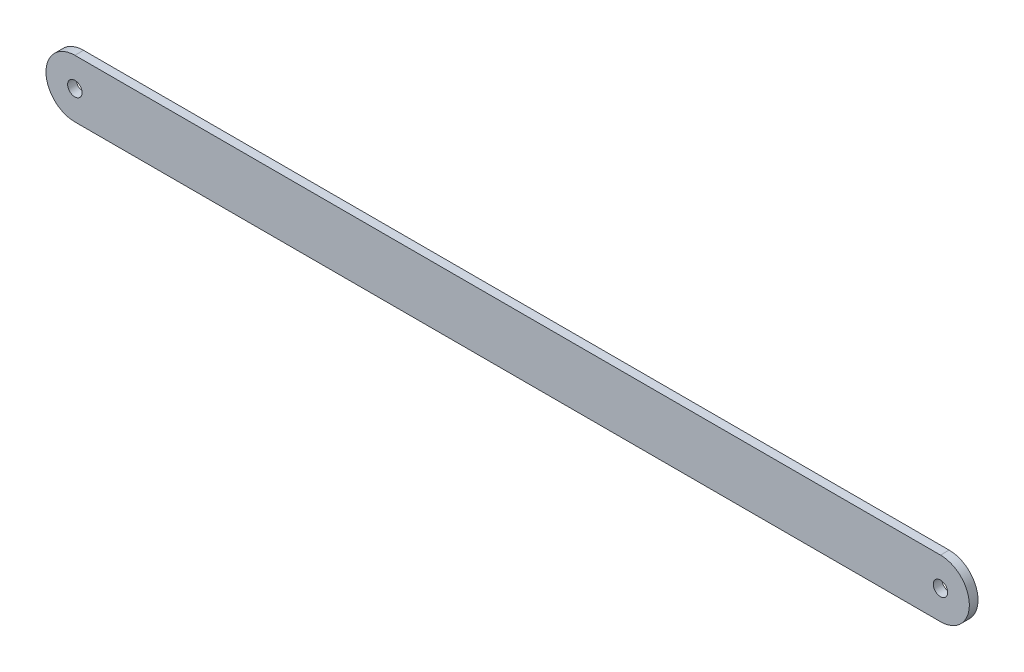
ISO-10303-21;
HEADER;
FILE_DESCRIPTION(('STEP AP214'),'2;1');
FILE_NAME('part.step','',(''),(''),'','','');
FILE_SCHEMA(('AUTOMOTIVE_DESIGN { 1 0 10303 214 1 1 1 1 }'));
ENDSEC;
DATA;
#1=APPLICATION_CONTEXT('core data for automotive mechanical design processes');
#2=APPLICATION_PROTOCOL_DEFINITION('international standard','automotive_design',2000,#1);
#3=PRODUCT_CONTEXT('',#1,'mechanical');
#4=PRODUCT('Part','Part','',(#3));
#5=PRODUCT_RELATED_PRODUCT_CATEGORY('part','',(#4));
#6=PRODUCT_DEFINITION_FORMATION('','',#4);
#7=PRODUCT_DEFINITION_CONTEXT('part definition',#1,'design');
#8=PRODUCT_DEFINITION('design','',#6,#7);
#9=PRODUCT_DEFINITION_SHAPE('','',#8);
#10=(LENGTH_UNIT() NAMED_UNIT(*) SI_UNIT(.MILLI.,.METRE.));
#11=(NAMED_UNIT(*) PLANE_ANGLE_UNIT() SI_UNIT($,.RADIAN.));
#12=(NAMED_UNIT(*) SI_UNIT($,.STERADIAN.) SOLID_ANGLE_UNIT());
#13=UNCERTAINTY_MEASURE_WITH_UNIT(LENGTH_MEASURE(1.E-05),#10,'distance_accuracy_value','');
#14=(GEOMETRIC_REPRESENTATION_CONTEXT(3) GLOBAL_UNCERTAINTY_ASSIGNED_CONTEXT((#13)) GLOBAL_UNIT_ASSIGNED_CONTEXT((#10,
#11,#12)) REPRESENTATION_CONTEXT('',''));
#15=CARTESIAN_POINT('',(0.,0.,0.));
#16=DIRECTION('',(0.,0.,1.));
#17=DIRECTION('',(1.,0.,0.));
#18=AXIS2_PLACEMENT_3D('',#15,#16,#17);
#19=CARTESIAN_POINT('',(-150.,0.,3.));
#20=DIRECTION('',(0.,0.,-1.));
#21=DIRECTION('',(-1.,0.,0.));
#22=AXIS2_PLACEMENT_3D('',#19,#20,#21);
#23=CYLINDRICAL_SURFACE('',#22,10.0000000000001);
#24=CARTESIAN_POINT('',(-150.,0.,0.));
#25=DIRECTION('',(0.,0.,1.));
#26=DIRECTION('',(1.,0.,0.));
#27=AXIS2_PLACEMENT_3D('',#24,#25,#26);
#28=CIRCLE('',#27,10.0000000000001);
#29=CARTESIAN_POINT('',(-150.,10.0000000000001,0.));
#30=VERTEX_POINT('',#29);
#31=CARTESIAN_POINT('',(-150.,-10.0000000000001,0.));
#32=VERTEX_POINT('',#31);
#33=EDGE_CURVE('E102',#30,#32,#28,.T.);
#34=ORIENTED_EDGE('',*,*,#33,.T.);
#35=DIRECTION('',(0.,0.,-1.));
#36=VECTOR('',#35,1.);
#37=CARTESIAN_POINT('',(-150.,-10.0000000000001,3.));
#38=LINE('',#37,#36);
#39=CARTESIAN_POINT('',(-150.,-10.0000000000001,3.));
#40=VERTEX_POINT('',#39);
#41=EDGE_CURVE('E11',#40,#32,#38,.T.);
#42=ORIENTED_EDGE('',*,*,#41,.F.);
#43=CARTESIAN_POINT('',(-150.,0.,3.));
#44=DIRECTION('',(0.,0.,1.));
#45=DIRECTION('',(1.,0.,0.));
#46=AXIS2_PLACEMENT_3D('',#43,#44,#45);
#47=CIRCLE('',#46,10.0000000000001);
#48=CARTESIAN_POINT('',(-150.,10.0000000000001,3.));
#49=VERTEX_POINT('',#48);
#50=EDGE_CURVE('E90',#49,#40,#47,.T.);
#51=ORIENTED_EDGE('',*,*,#50,.F.);
#52=DIRECTION('',(0.,0.,-1.));
#53=VECTOR('',#52,1.);
#54=CARTESIAN_POINT('',(-150.,10.0000000000001,3.));
#55=LINE('',#54,#53);
#56=EDGE_CURVE('E98',#49,#30,#55,.T.);
#57=ORIENTED_EDGE('',*,*,#56,.T.);
#58=EDGE_LOOP('',(#34,#42,#51,#57));
#59=FACE_BOUND('',#58,.T.);
#60=ADVANCED_FACE('F39',(#59),#23,.T.);
#61=CARTESIAN_POINT('',(-150.,-10.0000000000001,3.));
#62=DIRECTION('',(0.,1.,0.));
#63=DIRECTION('',(-1.,0.,0.));
#64=AXIS2_PLACEMENT_3D('',#61,#62,#63);
#65=PLANE('',#64);
#66=DIRECTION('',(1.,0.,0.));
#67=VECTOR('',#66,1.);
#68=CARTESIAN_POINT('',(-150.,-10.0000000000001,0.));
#69=LINE('',#68,#67);
#70=CARTESIAN_POINT('',(150.,-10.0000000000001,0.));
#71=VERTEX_POINT('',#70);
#72=EDGE_CURVE('E94',#32,#71,#69,.T.);
#73=ORIENTED_EDGE('',*,*,#72,.T.);
#74=DIRECTION('',(0.,0.,-1.));
#75=VECTOR('',#74,1.);
#76=CARTESIAN_POINT('',(150.,-10.0000000000001,3.));
#77=LINE('',#76,#75);
#78=CARTESIAN_POINT('',(150.,-10.0000000000001,3.));
#79=VERTEX_POINT('',#78);
#80=EDGE_CURVE('E47',#79,#71,#77,.T.);
#81=ORIENTED_EDGE('',*,*,#80,.F.);
#82=DIRECTION('',(1.,0.,0.));
#83=VECTOR('',#82,1.);
#84=CARTESIAN_POINT('',(-150.,-10.0000000000001,3.));
#85=LINE('',#84,#83);
#86=EDGE_CURVE('E85',#40,#79,#85,.T.);
#87=ORIENTED_EDGE('',*,*,#86,.F.);
#88=ORIENTED_EDGE('',*,*,#41,.T.);
#89=EDGE_LOOP('',(#73,#81,#87,#88));
#90=FACE_BOUND('',#89,.T.);
#91=ADVANCED_FACE('F93',(#90),#65,.F.);
#92=CARTESIAN_POINT('',(150.,0.,3.));
#93=DIRECTION('',(0.,0.,-1.));
#94=DIRECTION('',(-1.,0.,0.));
#95=AXIS2_PLACEMENT_3D('',#92,#93,#94);
#96=CYLINDRICAL_SURFACE('',#95,10.0000000000001);
#97=CARTESIAN_POINT('',(150.,0.,0.));
#98=DIRECTION('',(0.,0.,1.));
#99=DIRECTION('',(1.,0.,0.));
#100=AXIS2_PLACEMENT_3D('',#97,#98,#99);
#101=CIRCLE('',#100,10.0000000000001);
#102=CARTESIAN_POINT('',(150.,10.0000000000001,0.));
#103=VERTEX_POINT('',#102);
#104=EDGE_CURVE('E72',#71,#103,#101,.T.);
#105=ORIENTED_EDGE('',*,*,#104,.T.);
#106=DIRECTION('',(0.,0.,-1.));
#107=VECTOR('',#106,1.);
#108=CARTESIAN_POINT('',(150.,10.0000000000001,3.));
#109=LINE('',#108,#107);
#110=CARTESIAN_POINT('',(150.,10.0000000000001,3.));
#111=VERTEX_POINT('',#110);
#112=EDGE_CURVE('E95',#111,#103,#109,.T.);
#113=ORIENTED_EDGE('',*,*,#112,.F.);
#114=CARTESIAN_POINT('',(150.,0.,3.));
#115=DIRECTION('',(0.,0.,1.));
#116=DIRECTION('',(1.,0.,0.));
#117=AXIS2_PLACEMENT_3D('',#114,#115,#116);
#118=CIRCLE('',#117,10.0000000000001);
#119=EDGE_CURVE('E88',#79,#111,#118,.T.);
#120=ORIENTED_EDGE('',*,*,#119,.F.);
#121=ORIENTED_EDGE('',*,*,#80,.T.);
#122=EDGE_LOOP('',(#105,#113,#120,#121));
#123=FACE_BOUND('',#122,.T.);
#124=ADVANCED_FACE('F96',(#123),#96,.T.);
#125=CARTESIAN_POINT('',(-150.,10.0000000000001,3.));
#126=DIRECTION('',(0.,-1.,0.));
#127=DIRECTION('',(1.,0.,0.));
#128=AXIS2_PLACEMENT_3D('',#125,#126,#127);
#129=PLANE('',#128);
#130=DIRECTION('',(-1.,0.,0.));
#131=VECTOR('',#130,1.);
#132=CARTESIAN_POINT('',(-150.,10.0000000000001,0.));
#133=LINE('',#132,#131);
#134=EDGE_CURVE('E78',#103,#30,#133,.T.);
#135=ORIENTED_EDGE('',*,*,#134,.T.);
#136=ORIENTED_EDGE('',*,*,#56,.F.);
#137=DIRECTION('',(-1.,0.,0.));
#138=VECTOR('',#137,1.);
#139=CARTESIAN_POINT('',(-150.,10.0000000000001,3.));
#140=LINE('',#139,#138);
#141=EDGE_CURVE('E55',#111,#49,#140,.T.);
#142=ORIENTED_EDGE('',*,*,#141,.F.);
#143=ORIENTED_EDGE('',*,*,#112,.T.);
#144=EDGE_LOOP('',(#135,#136,#142,#143));
#145=FACE_BOUND('',#144,.T.);
#146=ADVANCED_FACE('F110',(#145),#129,.F.);
#147=CARTESIAN_POINT('',(-150.,0.,3.));
#148=DIRECTION('',(0.,0.,1.));
#149=DIRECTION('',(1.,0.,0.));
#150=AXIS2_PLACEMENT_3D('',#147,#148,#149);
#151=PLANE('',#150);
#152=CARTESIAN_POINT('',(150.,0.,3.));
#153=DIRECTION('',(0.,0.,-1.));
#154=DIRECTION('',(-1.,0.,0.));
#155=AXIS2_PLACEMENT_3D('',#152,#153,#154);
#156=CIRCLE('',#155,2.5);
#157=CARTESIAN_POINT('',(147.5,0.,3.));
#158=VERTEX_POINT('',#157);
#159=EDGE_CURVE('E105',#158,#158,#156,.T.);
#160=ORIENTED_EDGE('',*,*,#159,.T.);
#161=EDGE_LOOP('',(#160));
#162=FACE_BOUND('',#161,.T.);
#163=CARTESIAN_POINT('',(-150.,0.,3.));
#164=DIRECTION('',(0.,0.,-1.));
#165=DIRECTION('',(-1.,0.,0.));
#166=AXIS2_PLACEMENT_3D('',#163,#164,#165);
#167=CIRCLE('',#166,2.5);
#168=CARTESIAN_POINT('',(-152.5,0.,3.));
#169=VERTEX_POINT('',#168);
#170=EDGE_CURVE('E116',#169,#169,#167,.T.);
#171=ORIENTED_EDGE('',*,*,#170,.T.);
#172=EDGE_LOOP('',(#171));
#173=FACE_BOUND('',#172,.T.);
#174=ORIENTED_EDGE('',*,*,#50,.T.);
#175=ORIENTED_EDGE('',*,*,#86,.T.);
#176=ORIENTED_EDGE('',*,*,#119,.T.);
#177=ORIENTED_EDGE('',*,*,#141,.T.);
#178=EDGE_LOOP('',(#174,#175,#176,#177));
#179=FACE_BOUND('',#178,.T.);
#180=ADVANCED_FACE('F86',(#162,#173,#179),#151,.T.);
#181=CARTESIAN_POINT('',(-150.,0.,0.));
#182=DIRECTION('',(0.,0.,1.));
#183=DIRECTION('',(1.,0.,0.));
#184=AXIS2_PLACEMENT_3D('',#181,#182,#183);
#185=PLANE('',#184);
#186=CARTESIAN_POINT('',(150.,0.,0.));
#187=DIRECTION('',(0.,0.,-1.));
#188=DIRECTION('',(-1.,0.,0.));
#189=AXIS2_PLACEMENT_3D('',#186,#187,#188);
#190=CIRCLE('',#189,2.5);
#191=CARTESIAN_POINT('',(147.5,0.,0.));
#192=VERTEX_POINT('',#191);
#193=EDGE_CURVE('E122',#192,#192,#190,.T.);
#194=ORIENTED_EDGE('',*,*,#193,.F.);
#195=EDGE_LOOP('',(#194));
#196=FACE_BOUND('',#195,.T.);
#197=CARTESIAN_POINT('',(-150.,0.,0.));
#198=DIRECTION('',(0.,0.,-1.));
#199=DIRECTION('',(-1.,0.,0.));
#200=AXIS2_PLACEMENT_3D('',#197,#198,#199);
#201=CIRCLE('',#200,2.5);
#202=CARTESIAN_POINT('',(-152.5,0.,0.));
#203=VERTEX_POINT('',#202);
#204=EDGE_CURVE('E119',#203,#203,#201,.T.);
#205=ORIENTED_EDGE('',*,*,#204,.F.);
#206=EDGE_LOOP('',(#205));
#207=FACE_BOUND('',#206,.T.);
#208=ORIENTED_EDGE('',*,*,#33,.F.);
#209=ORIENTED_EDGE('',*,*,#134,.F.);
#210=ORIENTED_EDGE('',*,*,#104,.F.);
#211=ORIENTED_EDGE('',*,*,#72,.F.);
#212=EDGE_LOOP('',(#208,#209,#210,#211));
#213=FACE_BOUND('',#212,.T.);
#214=ADVANCED_FACE('F113',(#196,#207,#213),#185,.F.);
#215=CARTESIAN_POINT('',(-150.,0.,3.));
#216=DIRECTION('',(0.,0.,-1.));
#217=DIRECTION('',(-1.,0.,0.));
#218=AXIS2_PLACEMENT_3D('',#215,#216,#217);
#219=CYLINDRICAL_SURFACE('',#218,2.5);
#220=ORIENTED_EDGE('',*,*,#170,.F.);
#221=EDGE_LOOP('',(#220));
#222=FACE_BOUND('',#221,.T.);
#223=ORIENTED_EDGE('',*,*,#204,.T.);
#224=EDGE_LOOP('',(#223));
#225=FACE_BOUND('',#224,.T.);
#226=ADVANCED_FACE('F133',(#222,#225),#219,.F.);
#227=CARTESIAN_POINT('',(150.,0.,3.));
#228=DIRECTION('',(0.,0.,-1.));
#229=DIRECTION('',(-1.,0.,0.));
#230=AXIS2_PLACEMENT_3D('',#227,#228,#229);
#231=CYLINDRICAL_SURFACE('',#230,2.5);
#232=ORIENTED_EDGE('',*,*,#159,.F.);
#233=EDGE_LOOP('',(#232));
#234=FACE_BOUND('',#233,.T.);
#235=ORIENTED_EDGE('',*,*,#193,.T.);
#236=EDGE_LOOP('',(#235));
#237=FACE_BOUND('',#236,.T.);
#238=ADVANCED_FACE('F130',(#234,#237),#231,.F.);
#239=CLOSED_SHELL('',(#60,#91,#124,#146,#180,#214,#226,#238));
#240=MANIFOLD_SOLID_BREP('B2',#239);
#241=ADVANCED_BREP_SHAPE_REPRESENTATION('',(#18,#240),#14);
#242=SHAPE_DEFINITION_REPRESENTATION(#9,#241);
ENDSEC;
END-ISO-10303-21;
